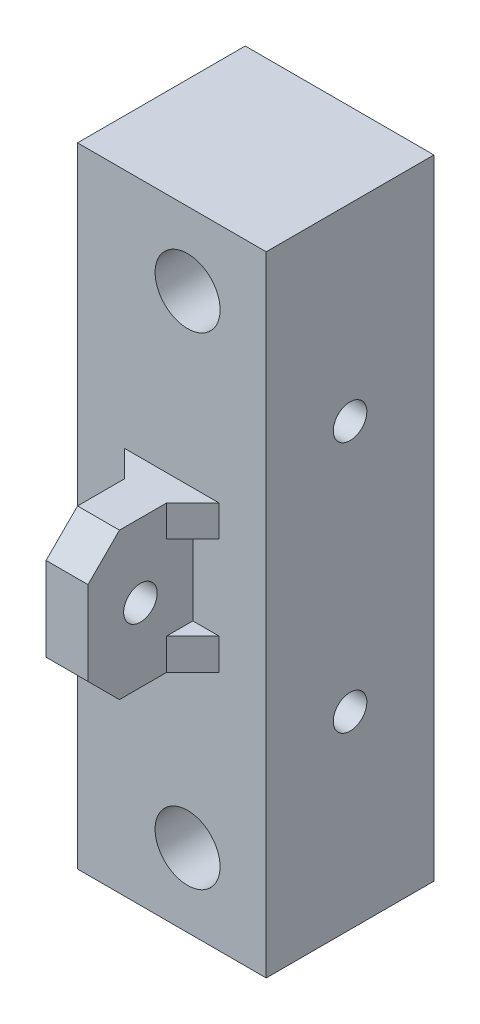
ISO-10303-21;
HEADER;
FILE_DESCRIPTION(('STEP AP214'),'2;1');
FILE_NAME('part.step','',(''),(''),'','','');
FILE_SCHEMA(('AUTOMOTIVE_DESIGN { 1 0 10303 214 1 1 1 1 }'));
ENDSEC;
DATA;
#1=APPLICATION_CONTEXT('core data for automotive mechanical design processes');
#2=APPLICATION_PROTOCOL_DEFINITION('international standard','automotive_design',2000,#1);
#3=PRODUCT_CONTEXT('',#1,'mechanical');
#4=PRODUCT('Part','Part','',(#3));
#5=PRODUCT_RELATED_PRODUCT_CATEGORY('part','',(#4));
#6=PRODUCT_DEFINITION_FORMATION('','',#4);
#7=PRODUCT_DEFINITION_CONTEXT('part definition',#1,'design');
#8=PRODUCT_DEFINITION('design','',#6,#7);
#9=PRODUCT_DEFINITION_SHAPE('','',#8);
#10=(LENGTH_UNIT() NAMED_UNIT(*) SI_UNIT(.MILLI.,.METRE.));
#11=(NAMED_UNIT(*) PLANE_ANGLE_UNIT() SI_UNIT($,.RADIAN.));
#12=(NAMED_UNIT(*) SI_UNIT($,.STERADIAN.) SOLID_ANGLE_UNIT());
#13=UNCERTAINTY_MEASURE_WITH_UNIT(LENGTH_MEASURE(1.E-05),#10,'distance_accuracy_value','');
#14=(GEOMETRIC_REPRESENTATION_CONTEXT(3) GLOBAL_UNCERTAINTY_ASSIGNED_CONTEXT((#13)) GLOBAL_UNIT_ASSIGNED_CONTEXT((#10,
#11,#12)) REPRESENTATION_CONTEXT('',''));
#15=CARTESIAN_POINT('',(0.,0.,0.));
#16=DIRECTION('',(0.,0.,1.));
#17=DIRECTION('',(1.,0.,0.));
#18=AXIS2_PLACEMENT_3D('',#15,#16,#17);
#19=CARTESIAN_POINT('',(0.,0.,16.));
#20=DIRECTION('',(0.,0.,1.));
#21=DIRECTION('',(1.,0.,0.));
#22=AXIS2_PLACEMENT_3D('',#19,#20,#21);
#23=PLANE('',#22);
#24=DIRECTION('',(1.,0.,0.));
#25=VECTOR('',#24,1.);
#26=CARTESIAN_POINT('',(4.5,-4.,16.));
#27=LINE('',#26,#25);
#28=CARTESIAN_POINT('',(2.,-4.,16.));
#29=VERTEX_POINT('',#28);
#30=CARTESIAN_POINT('',(4.5,-4.,16.));
#31=VERTEX_POINT('',#30);
#32=EDGE_CURVE('E51',#29,#31,#27,.T.);
#33=ORIENTED_EDGE('',*,*,#32,.T.);
#34=DIRECTION('',(0.,-1.,0.));
#35=VECTOR('',#34,1.);
#36=CARTESIAN_POINT('',(4.5,-4.,16.));
#37=LINE('',#36,#35);
#38=CARTESIAN_POINT('',(4.5,-7.,16.));
#39=VERTEX_POINT('',#38);
#40=EDGE_CURVE('E305',#31,#39,#37,.T.);
#41=ORIENTED_EDGE('',*,*,#40,.T.);
#42=DIRECTION('',(1.,0.,0.));
#43=VECTOR('',#42,1.);
#44=CARTESIAN_POINT('',(-2.,-7.,16.));
#45=LINE('',#44,#43);
#46=CARTESIAN_POINT('',(-4.5,-7.,16.));
#47=VERTEX_POINT('',#46);
#48=EDGE_CURVE('E59',#47,#39,#45,.T.);
#49=ORIENTED_EDGE('',*,*,#48,.F.);
#50=DIRECTION('',(0.,-1.,0.));
#51=VECTOR('',#50,1.);
#52=CARTESIAN_POINT('',(-4.5,-4.,16.));
#53=LINE('',#52,#51);
#54=CARTESIAN_POINT('',(-4.5,-4.,16.));
#55=VERTEX_POINT('',#54);
#56=EDGE_CURVE('E178',#55,#47,#53,.T.);
#57=ORIENTED_EDGE('',*,*,#56,.F.);
#58=DIRECTION('',(1.,0.,0.));
#59=VECTOR('',#58,1.);
#60=CARTESIAN_POINT('',(-4.5,-4.,16.));
#61=LINE('',#60,#59);
#62=CARTESIAN_POINT('',(-2.,-4.,16.));
#63=VERTEX_POINT('',#62);
#64=EDGE_CURVE('E165',#55,#63,#61,.T.);
#65=ORIENTED_EDGE('',*,*,#64,.T.);
#66=DIRECTION('',(0.,-1.,0.));
#67=VECTOR('',#66,1.);
#68=CARTESIAN_POINT('',(-2.,7.,16.));
#69=LINE('',#68,#67);
#70=CARTESIAN_POINT('',(-2.,4.,16.));
#71=VERTEX_POINT('',#70);
#72=EDGE_CURVE('E175',#71,#63,#69,.T.);
#73=ORIENTED_EDGE('',*,*,#72,.F.);
#74=DIRECTION('',(-1.,0.,0.));
#75=VECTOR('',#74,1.);
#76=CARTESIAN_POINT('',(-2.,4.,16.));
#77=LINE('',#76,#75);
#78=CARTESIAN_POINT('',(-4.50000000000001,4.,16.));
#79=VERTEX_POINT('',#78);
#80=EDGE_CURVE('E313',#71,#79,#77,.T.);
#81=ORIENTED_EDGE('',*,*,#80,.T.);
#82=DIRECTION('',(0.,1.,0.));
#83=VECTOR('',#82,1.);
#84=CARTESIAN_POINT('',(-4.5,4.,16.));
#85=LINE('',#84,#83);
#86=CARTESIAN_POINT('',(-4.5,7.,16.));
#87=VERTEX_POINT('',#86);
#88=EDGE_CURVE('E319',#79,#87,#85,.T.);
#89=ORIENTED_EDGE('',*,*,#88,.T.);
#90=DIRECTION('',(-1.,0.,0.));
#91=VECTOR('',#90,1.);
#92=CARTESIAN_POINT('',(-2.,7.,16.));
#93=LINE('',#92,#91);
#94=CARTESIAN_POINT('',(4.5,7.,16.));
#95=VERTEX_POINT('',#94);
#96=EDGE_CURVE('E184',#95,#87,#93,.T.);
#97=ORIENTED_EDGE('',*,*,#96,.F.);
#98=DIRECTION('',(0.,1.,0.));
#99=VECTOR('',#98,1.);
#100=CARTESIAN_POINT('',(4.5,4.,16.));
#101=LINE('',#100,#99);
#102=CARTESIAN_POINT('',(4.5,4.,16.));
#103=VERTEX_POINT('',#102);
#104=EDGE_CURVE('E339',#103,#95,#101,.T.);
#105=ORIENTED_EDGE('',*,*,#104,.F.);
#106=DIRECTION('',(-1.,0.,0.));
#107=VECTOR('',#106,1.);
#108=CARTESIAN_POINT('',(2.,4.,16.));
#109=LINE('',#108,#107);
#110=CARTESIAN_POINT('',(2.,4.,16.));
#111=VERTEX_POINT('',#110);
#112=EDGE_CURVE('E333',#103,#111,#109,.T.);
#113=ORIENTED_EDGE('',*,*,#112,.T.);
#114=DIRECTION('',(0.,1.,0.));
#115=VECTOR('',#114,1.);
#116=CARTESIAN_POINT('',(2.,7.,16.));
#117=LINE('',#116,#115);
#118=EDGE_CURVE('E188',#29,#111,#117,.T.);
#119=ORIENTED_EDGE('',*,*,#118,.F.);
#120=EDGE_LOOP('',(#33,#41,#49,#57,#65,#73,#81,#89,#97,#105,#113,#119));
#121=FACE_BOUND('',#120,.T.);
#122=CARTESIAN_POINT('',(1.5,23.,16.));
#123=DIRECTION('',(0.,0.,1.));
#124=DIRECTION('',(1.,0.,0.));
#125=AXIS2_PLACEMENT_3D('',#122,#123,#124);
#126=CIRCLE('',#125,3.1);
#127=CARTESIAN_POINT('',(4.6,23.,16.));
#128=VERTEX_POINT('',#127);
#129=EDGE_CURVE('E220',#128,#128,#126,.T.);
#130=ORIENTED_EDGE('',*,*,#129,.F.);
#131=EDGE_LOOP('',(#130));
#132=FACE_BOUND('',#131,.T.);
#133=CARTESIAN_POINT('',(1.5,-23.,16.));
#134=DIRECTION('',(0.,0.,1.));
#135=DIRECTION('',(1.,0.,0.));
#136=AXIS2_PLACEMENT_3D('',#133,#134,#135);
#137=CIRCLE('',#136,3.1);
#138=CARTESIAN_POINT('',(4.6,-23.,16.));
#139=VERTEX_POINT('',#138);
#140=EDGE_CURVE('E207',#139,#139,#137,.T.);
#141=ORIENTED_EDGE('',*,*,#140,.F.);
#142=EDGE_LOOP('',(#141));
#143=FACE_BOUND('',#142,.T.);
#144=DIRECTION('',(0.,1.,0.));
#145=VECTOR('',#144,1.);
#146=CARTESIAN_POINT('',(9.,30.,16.));
#147=LINE('',#146,#145);
#148=CARTESIAN_POINT('',(9.,-30.,16.));
#149=VERTEX_POINT('',#148);
#150=CARTESIAN_POINT('',(9.,30.,16.));
#151=VERTEX_POINT('',#150);
#152=EDGE_CURVE('E228',#149,#151,#147,.T.);
#153=ORIENTED_EDGE('',*,*,#152,.T.);
#154=DIRECTION('',(-1.,0.,0.));
#155=VECTOR('',#154,1.);
#156=CARTESIAN_POINT('',(-9.,30.,16.));
#157=LINE('',#156,#155);
#158=CARTESIAN_POINT('',(-9.,30.,16.));
#159=VERTEX_POINT('',#158);
#160=EDGE_CURVE('E231',#151,#159,#157,.T.);
#161=ORIENTED_EDGE('',*,*,#160,.T.);
#162=DIRECTION('',(0.,-1.,0.));
#163=VECTOR('',#162,1.);
#164=CARTESIAN_POINT('',(-9.,30.,16.));
#165=LINE('',#164,#163);
#166=CARTESIAN_POINT('',(-9.,-30.,16.));
#167=VERTEX_POINT('',#166);
#168=EDGE_CURVE('E234',#159,#167,#165,.T.);
#169=ORIENTED_EDGE('',*,*,#168,.T.);
#170=DIRECTION('',(1.,0.,0.));
#171=VECTOR('',#170,1.);
#172=CARTESIAN_POINT('',(-9.,-30.,16.));
#173=LINE('',#172,#171);
#174=EDGE_CURVE('E236',#167,#149,#173,.T.);
#175=ORIENTED_EDGE('',*,*,#174,.T.);
#176=EDGE_LOOP('',(#153,#161,#169,#175));
#177=FACE_BOUND('',#176,.T.);
#178=ADVANCED_FACE('F35',(#121,#132,#143,#177),#23,.T.);
#179=CARTESIAN_POINT('',(9.,30.,16.));
#180=DIRECTION('',(-1.,0.,0.));
#181=DIRECTION('',(0.,-1.,0.));
#182=AXIS2_PLACEMENT_3D('',#179,#180,#181);
#183=PLANE('',#182);
#184=CARTESIAN_POINT('',(9.,12.,8.));
#185=DIRECTION('',(1.,0.,0.));
#186=DIRECTION('',(0.,1.,0.));
#187=AXIS2_PLACEMENT_3D('',#184,#185,#186);
#188=CIRCLE('',#187,1.6);
#189=CARTESIAN_POINT('',(9.,13.6,8.));
#190=VERTEX_POINT('',#189);
#191=EDGE_CURVE('E208',#190,#190,#188,.T.);
#192=ORIENTED_EDGE('',*,*,#191,.F.);
#193=EDGE_LOOP('',(#192));
#194=FACE_BOUND('',#193,.T.);
#195=CARTESIAN_POINT('',(9.,-12.,8.));
#196=DIRECTION('',(1.,0.,0.));
#197=DIRECTION('',(0.,1.,0.));
#198=AXIS2_PLACEMENT_3D('',#195,#196,#197);
#199=CIRCLE('',#198,1.6);
#200=CARTESIAN_POINT('',(9.,-10.4,8.));
#201=VERTEX_POINT('',#200);
#202=EDGE_CURVE('E203',#201,#201,#199,.T.);
#203=ORIENTED_EDGE('',*,*,#202,.F.);
#204=EDGE_LOOP('',(#203));
#205=FACE_BOUND('',#204,.T.);
#206=DIRECTION('',(0.,1.,0.));
#207=VECTOR('',#206,1.);
#208=CARTESIAN_POINT('',(9.,30.,0.));
#209=LINE('',#208,#207);
#210=CARTESIAN_POINT('',(9.,-30.,0.));
#211=VERTEX_POINT('',#210);
#212=CARTESIAN_POINT('',(9.,30.,0.));
#213=VERTEX_POINT('',#212);
#214=EDGE_CURVE('E219',#211,#213,#209,.T.);
#215=ORIENTED_EDGE('',*,*,#214,.T.);
#216=DIRECTION('',(0.,0.,-1.));
#217=VECTOR('',#216,1.);
#218=CARTESIAN_POINT('',(9.,30.,16.));
#219=LINE('',#218,#217);
#220=EDGE_CURVE('E254',#151,#213,#219,.T.);
#221=ORIENTED_EDGE('',*,*,#220,.F.);
#222=ORIENTED_EDGE('',*,*,#152,.F.);
#223=DIRECTION('',(0.,0.,-1.));
#224=VECTOR('',#223,1.);
#225=CARTESIAN_POINT('',(9.,-30.,16.));
#226=LINE('',#225,#224);
#227=EDGE_CURVE('E238',#149,#211,#226,.T.);
#228=ORIENTED_EDGE('',*,*,#227,.T.);
#229=EDGE_LOOP('',(#215,#221,#222,#228));
#230=FACE_BOUND('',#229,.T.);
#231=ADVANCED_FACE('F380',(#194,#205,#230),#183,.F.);
#232=CARTESIAN_POINT('',(-9.,30.,16.));
#233=DIRECTION('',(0.,-1.,0.));
#234=DIRECTION('',(0.,0.,-1.));
#235=AXIS2_PLACEMENT_3D('',#232,#233,#234);
#236=PLANE('',#235);
#237=DIRECTION('',(-1.,0.,0.));
#238=VECTOR('',#237,1.);
#239=CARTESIAN_POINT('',(-9.,30.,0.));
#240=LINE('',#239,#238);
#241=CARTESIAN_POINT('',(-9.,30.,0.));
#242=VERTEX_POINT('',#241);
#243=EDGE_CURVE('E241',#213,#242,#240,.T.);
#244=ORIENTED_EDGE('',*,*,#243,.T.);
#245=DIRECTION('',(0.,0.,-1.));
#246=VECTOR('',#245,1.);
#247=CARTESIAN_POINT('',(-9.,30.,16.));
#248=LINE('',#247,#246);
#249=EDGE_CURVE('E251',#159,#242,#248,.T.);
#250=ORIENTED_EDGE('',*,*,#249,.F.);
#251=ORIENTED_EDGE('',*,*,#160,.F.);
#252=ORIENTED_EDGE('',*,*,#220,.T.);
#253=EDGE_LOOP('',(#244,#250,#251,#252));
#254=FACE_BOUND('',#253,.T.);
#255=ADVANCED_FACE('F385',(#254),#236,.F.);
#256=CARTESIAN_POINT('',(-9.,30.,16.));
#257=DIRECTION('',(1.,0.,0.));
#258=DIRECTION('',(0.,1.,0.));
#259=AXIS2_PLACEMENT_3D('',#256,#257,#258);
#260=PLANE('',#259);
#261=CARTESIAN_POINT('',(-9.00000000000001,12.,8.));
#262=DIRECTION('',(1.,0.,0.));
#263=DIRECTION('',(0.,1.,0.));
#264=AXIS2_PLACEMENT_3D('',#261,#262,#263);
#265=CIRCLE('',#264,1.6);
#266=CARTESIAN_POINT('',(-9.00000000000001,13.6,8.));
#267=VERTEX_POINT('',#266);
#268=EDGE_CURVE('E204',#267,#267,#265,.T.);
#269=ORIENTED_EDGE('',*,*,#268,.T.);
#270=EDGE_LOOP('',(#269));
#271=FACE_BOUND('',#270,.T.);
#272=CARTESIAN_POINT('',(-9.00000000000001,-12.,8.));
#273=DIRECTION('',(1.,0.,0.));
#274=DIRECTION('',(0.,1.,0.));
#275=AXIS2_PLACEMENT_3D('',#272,#273,#274);
#276=CIRCLE('',#275,1.6);
#277=CARTESIAN_POINT('',(-9.00000000000001,-10.4,8.));
#278=VERTEX_POINT('',#277);
#279=EDGE_CURVE('E211',#278,#278,#276,.T.);
#280=ORIENTED_EDGE('',*,*,#279,.T.);
#281=EDGE_LOOP('',(#280));
#282=FACE_BOUND('',#281,.T.);
#283=DIRECTION('',(0.,-1.,0.));
#284=VECTOR('',#283,1.);
#285=CARTESIAN_POINT('',(-9.,30.,0.));
#286=LINE('',#285,#284);
#287=CARTESIAN_POINT('',(-9.,-30.,0.));
#288=VERTEX_POINT('',#287);
#289=EDGE_CURVE('E243',#242,#288,#286,.T.);
#290=ORIENTED_EDGE('',*,*,#289,.T.);
#291=DIRECTION('',(0.,0.,-1.));
#292=VECTOR('',#291,1.);
#293=CARTESIAN_POINT('',(-9.,-30.,16.));
#294=LINE('',#293,#292);
#295=EDGE_CURVE('E248',#167,#288,#294,.T.);
#296=ORIENTED_EDGE('',*,*,#295,.F.);
#297=ORIENTED_EDGE('',*,*,#168,.F.);
#298=ORIENTED_EDGE('',*,*,#249,.T.);
#299=EDGE_LOOP('',(#290,#296,#297,#298));
#300=FACE_BOUND('',#299,.T.);
#301=ADVANCED_FACE('F399',(#271,#282,#300),#260,.F.);
#302=CARTESIAN_POINT('',(-9.,-30.,16.));
#303=DIRECTION('',(0.,1.,0.));
#304=DIRECTION('',(0.,0.,1.));
#305=AXIS2_PLACEMENT_3D('',#302,#303,#304);
#306=PLANE('',#305);
#307=DIRECTION('',(1.,0.,0.));
#308=VECTOR('',#307,1.);
#309=CARTESIAN_POINT('',(-9.,-30.,0.));
#310=LINE('',#309,#308);
#311=EDGE_CURVE('E232',#288,#211,#310,.T.);
#312=ORIENTED_EDGE('',*,*,#311,.T.);
#313=ORIENTED_EDGE('',*,*,#227,.F.);
#314=ORIENTED_EDGE('',*,*,#174,.F.);
#315=ORIENTED_EDGE('',*,*,#295,.T.);
#316=EDGE_LOOP('',(#312,#313,#314,#315));
#317=FACE_BOUND('',#316,.T.);
#318=ADVANCED_FACE('F395',(#317),#306,.F.);
#319=CARTESIAN_POINT('',(0.,0.,0.));
#320=DIRECTION('',(0.,0.,1.));
#321=DIRECTION('',(1.,0.,0.));
#322=AXIS2_PLACEMENT_3D('',#319,#320,#321);
#323=PLANE('',#322);
#324=CARTESIAN_POINT('',(1.5,23.,0.));
#325=DIRECTION('',(0.,0.,1.));
#326=DIRECTION('',(1.,0.,0.));
#327=AXIS2_PLACEMENT_3D('',#324,#325,#326);
#328=CIRCLE('',#327,3.1);
#329=CARTESIAN_POINT('',(4.6,23.,0.));
#330=VERTEX_POINT('',#329);
#331=EDGE_CURVE('E216',#330,#330,#328,.T.);
#332=ORIENTED_EDGE('',*,*,#331,.T.);
#333=EDGE_LOOP('',(#332));
#334=FACE_BOUND('',#333,.T.);
#335=CARTESIAN_POINT('',(1.5,-23.,0.));
#336=DIRECTION('',(0.,0.,1.));
#337=DIRECTION('',(1.,0.,0.));
#338=AXIS2_PLACEMENT_3D('',#335,#336,#337);
#339=CIRCLE('',#338,3.1);
#340=CARTESIAN_POINT('',(4.6,-23.,0.));
#341=VERTEX_POINT('',#340);
#342=EDGE_CURVE('E223',#341,#341,#339,.T.);
#343=ORIENTED_EDGE('',*,*,#342,.T.);
#344=EDGE_LOOP('',(#343));
#345=FACE_BOUND('',#344,.T.);
#346=ORIENTED_EDGE('',*,*,#214,.F.);
#347=ORIENTED_EDGE('',*,*,#311,.F.);
#348=ORIENTED_EDGE('',*,*,#289,.F.);
#349=ORIENTED_EDGE('',*,*,#243,.F.);
#350=EDGE_LOOP('',(#346,#347,#348,#349));
#351=FACE_BOUND('',#350,.T.);
#352=ADVANCED_FACE('F392',(#334,#345,#351),#323,.F.);
#353=CARTESIAN_POINT('',(1.5,-23.,0.));
#354=DIRECTION('',(0.,0.,1.));
#355=DIRECTION('',(1.,0.,0.));
#356=AXIS2_PLACEMENT_3D('',#353,#354,#355);
#357=CYLINDRICAL_SURFACE('',#356,3.1);
#358=ORIENTED_EDGE('',*,*,#342,.F.);
#359=EDGE_LOOP('',(#358));
#360=FACE_BOUND('',#359,.T.);
#361=ORIENTED_EDGE('',*,*,#140,.T.);
#362=EDGE_LOOP('',(#361));
#363=FACE_BOUND('',#362,.T.);
#364=ADVANCED_FACE('F390',(#360,#363),#357,.F.);
#365=CARTESIAN_POINT('',(1.5,23.,0.));
#366=DIRECTION('',(0.,0.,1.));
#367=DIRECTION('',(1.,0.,0.));
#368=AXIS2_PLACEMENT_3D('',#365,#366,#367);
#369=CYLINDRICAL_SURFACE('',#368,3.1);
#370=ORIENTED_EDGE('',*,*,#331,.F.);
#371=EDGE_LOOP('',(#370));
#372=FACE_BOUND('',#371,.T.);
#373=ORIENTED_EDGE('',*,*,#129,.T.);
#374=EDGE_LOOP('',(#373));
#375=FACE_BOUND('',#374,.T.);
#376=ADVANCED_FACE('F441',(#372,#375),#369,.F.);
#377=CARTESIAN_POINT('',(-9.00000000000001,-12.,8.));
#378=DIRECTION('',(1.,0.,0.));
#379=DIRECTION('',(0.,1.,0.));
#380=AXIS2_PLACEMENT_3D('',#377,#378,#379);
#381=CYLINDRICAL_SURFACE('',#380,1.6);
#382=ORIENTED_EDGE('',*,*,#279,.F.);
#383=EDGE_LOOP('',(#382));
#384=FACE_BOUND('',#383,.T.);
#385=ORIENTED_EDGE('',*,*,#202,.T.);
#386=EDGE_LOOP('',(#385));
#387=FACE_BOUND('',#386,.T.);
#388=ADVANCED_FACE('F438',(#384,#387),#381,.F.);
#389=CARTESIAN_POINT('',(-9.00000000000001,12.,8.));
#390=DIRECTION('',(1.,0.,0.));
#391=DIRECTION('',(0.,1.,0.));
#392=AXIS2_PLACEMENT_3D('',#389,#390,#391);
#393=CYLINDRICAL_SURFACE('',#392,1.6);
#394=ORIENTED_EDGE('',*,*,#268,.F.);
#395=EDGE_LOOP('',(#394));
#396=FACE_BOUND('',#395,.T.);
#397=ORIENTED_EDGE('',*,*,#191,.T.);
#398=EDGE_LOOP('',(#397));
#399=FACE_BOUND('',#398,.T.);
#400=ADVANCED_FACE('F434',(#396,#399),#393,.F.);
#401=CARTESIAN_POINT('',(2.,7.,26.));
#402=DIRECTION('',(-1.,0.,0.));
#403=DIRECTION('',(0.,-1.,0.));
#404=AXIS2_PLACEMENT_3D('',#401,#402,#403);
#405=PLANE('',#404);
#406=CARTESIAN_POINT('',(2.,0.,21.));
#407=DIRECTION('',(1.,0.,0.));
#408=DIRECTION('',(0.,1.,0.));
#409=AXIS2_PLACEMENT_3D('',#406,#407,#408);
#410=CIRCLE('',#409,1.6);
#411=CARTESIAN_POINT('',(2.,1.6,21.));
#412=VERTEX_POINT('',#411);
#413=EDGE_CURVE('E261',#412,#412,#410,.T.);
#414=ORIENTED_EDGE('',*,*,#413,.F.);
#415=EDGE_LOOP('',(#414));
#416=FACE_BOUND('',#415,.T.);
#417=DIRECTION('',(0.,0.,-1.));
#418=VECTOR('',#417,1.);
#419=CARTESIAN_POINT('',(2.,-7.,26.));
#420=LINE('',#419,#418);
#421=CARTESIAN_POINT('',(2.,-7.,23.));
#422=VERTEX_POINT('',#421);
#423=CARTESIAN_POINT('',(2.,-7.,18.5));
#424=VERTEX_POINT('',#423);
#425=EDGE_CURVE('E192',#422,#424,#420,.T.);
#426=ORIENTED_EDGE('',*,*,#425,.T.);
#427=DIRECTION('',(0.,-1.,0.));
#428=VECTOR('',#427,1.);
#429=CARTESIAN_POINT('',(2.,-4.,18.5));
#430=LINE('',#429,#428);
#431=CARTESIAN_POINT('',(2.,-4.,18.5));
#432=VERTEX_POINT('',#431);
#433=EDGE_CURVE('E303',#432,#424,#430,.T.);
#434=ORIENTED_EDGE('',*,*,#433,.F.);
#435=DIRECTION('',(0.,0.,-1.));
#436=VECTOR('',#435,1.);
#437=CARTESIAN_POINT('',(2.,-4.,16.));
#438=LINE('',#437,#436);
#439=EDGE_CURVE('E301',#432,#29,#438,.T.);
#440=ORIENTED_EDGE('',*,*,#439,.T.);
#441=ORIENTED_EDGE('',*,*,#118,.T.);
#442=DIRECTION('',(0.,0.,1.));
#443=VECTOR('',#442,1.);
#444=CARTESIAN_POINT('',(2.,4.,18.5));
#445=LINE('',#444,#443);
#446=CARTESIAN_POINT('',(2.,4.,18.5));
#447=VERTEX_POINT('',#446);
#448=EDGE_CURVE('E328',#111,#447,#445,.T.);
#449=ORIENTED_EDGE('',*,*,#448,.T.);
#450=DIRECTION('',(0.,1.,0.));
#451=VECTOR('',#450,1.);
#452=CARTESIAN_POINT('',(2.,4.,18.5));
#453=LINE('',#452,#451);
#454=CARTESIAN_POINT('',(2.,7.,18.5));
#455=VERTEX_POINT('',#454);
#456=EDGE_CURVE('E336',#447,#455,#453,.T.);
#457=ORIENTED_EDGE('',*,*,#456,.T.);
#458=DIRECTION('',(0.,0.,-1.));
#459=VECTOR('',#458,1.);
#460=CARTESIAN_POINT('',(2.,7.,26.));
#461=LINE('',#460,#459);
#462=CARTESIAN_POINT('',(2.,7.,23.));
#463=VERTEX_POINT('',#462);
#464=EDGE_CURVE('E200',#463,#455,#461,.T.);
#465=ORIENTED_EDGE('',*,*,#464,.F.);
#466=DIRECTION('',(0.,-0.707106781186546,0.707106781186549));
#467=VECTOR('',#466,1.);
#468=CARTESIAN_POINT('',(2.,4.,26.));
#469=LINE('',#468,#467);
#470=CARTESIAN_POINT('',(2.,4.,26.));
#471=VERTEX_POINT('',#470);
#472=EDGE_CURVE('E267',#463,#471,#469,.T.);
#473=ORIENTED_EDGE('',*,*,#472,.T.);
#474=DIRECTION('',(0.,1.,0.));
#475=VECTOR('',#474,1.);
#476=CARTESIAN_POINT('',(2.,7.,26.));
#477=LINE('',#476,#475);
#478=CARTESIAN_POINT('',(2.,-4.,26.));
#479=VERTEX_POINT('',#478);
#480=EDGE_CURVE('E186',#479,#471,#477,.T.);
#481=ORIENTED_EDGE('',*,*,#480,.F.);
#482=DIRECTION('',(0.,-0.707106781186546,-0.707106781186549));
#483=VECTOR('',#482,1.);
#484=CARTESIAN_POINT('',(2.,-4.,26.));
#485=LINE('',#484,#483);
#486=EDGE_CURVE('E269',#479,#422,#485,.T.);
#487=ORIENTED_EDGE('',*,*,#486,.T.);
#488=EDGE_LOOP('',(#426,#434,#440,#441,#449,#457,#465,#473,#481,#487));
#489=FACE_BOUND('',#488,.T.);
#490=ADVANCED_FACE('F290',(#416,#489),#405,.F.);
#491=CARTESIAN_POINT('',(-2.,7.,26.));
#492=DIRECTION('',(0.,-1.,0.));
#493=DIRECTION('',(0.,0.,-1.));
#494=AXIS2_PLACEMENT_3D('',#491,#492,#493);
#495=PLANE('',#494);
#496=DIRECTION('',(0.,0.,-1.));
#497=VECTOR('',#496,1.);
#498=CARTESIAN_POINT('',(-2.,7.,26.));
#499=LINE('',#498,#497);
#500=CARTESIAN_POINT('',(-2.,7.,23.));
#501=VERTEX_POINT('',#500);
#502=CARTESIAN_POINT('',(-2.,7.,18.5));
#503=VERTEX_POINT('',#502);
#504=EDGE_CURVE('E198',#501,#503,#499,.T.);
#505=ORIENTED_EDGE('',*,*,#504,.F.);
#506=DIRECTION('',(1.,0.,0.));
#507=VECTOR('',#506,1.);
#508=CARTESIAN_POINT('',(2.,7.,23.));
#509=LINE('',#508,#507);
#510=EDGE_CURVE('E11',#501,#463,#509,.T.);
#511=ORIENTED_EDGE('',*,*,#510,.T.);
#512=ORIENTED_EDGE('',*,*,#464,.T.);
#513=DIRECTION('',(0.707106781186548,0.,-0.707106781186547));
#514=VECTOR('',#513,1.);
#515=CARTESIAN_POINT('',(4.5,7.,16.));
#516=LINE('',#515,#514);
#517=EDGE_CURVE('E325',#455,#95,#516,.T.);
#518=ORIENTED_EDGE('',*,*,#517,.T.);
#519=ORIENTED_EDGE('',*,*,#96,.T.);
#520=DIRECTION('',(0.707106781186548,0.,0.707106781186547));
#521=VECTOR('',#520,1.);
#522=CARTESIAN_POINT('',(-4.5,7.,16.));
#523=LINE('',#522,#521);
#524=EDGE_CURVE('E311',#87,#503,#523,.T.);
#525=ORIENTED_EDGE('',*,*,#524,.T.);
#526=EDGE_LOOP('',(#505,#511,#512,#518,#519,#525));
#527=FACE_BOUND('',#526,.T.);
#528=ADVANCED_FACE('F357',(#527),#495,.F.);
#529=CARTESIAN_POINT('',(-2.,7.,26.));
#530=DIRECTION('',(1.,0.,0.));
#531=DIRECTION('',(0.,1.,0.));
#532=AXIS2_PLACEMENT_3D('',#529,#530,#531);
#533=PLANE('',#532);
#534=CARTESIAN_POINT('',(-2.,0.,21.));
#535=DIRECTION('',(1.,0.,0.));
#536=DIRECTION('',(0.,1.,0.));
#537=AXIS2_PLACEMENT_3D('',#534,#535,#536);
#538=CIRCLE('',#537,1.6);
#539=CARTESIAN_POINT('',(-2.,1.6,21.));
#540=VERTEX_POINT('',#539);
#541=EDGE_CURVE('E258',#540,#540,#538,.T.);
#542=ORIENTED_EDGE('',*,*,#541,.T.);
#543=EDGE_LOOP('',(#542));
#544=FACE_BOUND('',#543,.T.);
#545=DIRECTION('',(0.,0.,1.));
#546=VECTOR('',#545,1.);
#547=CARTESIAN_POINT('',(-2.,-4.,16.));
#548=LINE('',#547,#546);
#549=CARTESIAN_POINT('',(-2.,-4.,18.5));
#550=VERTEX_POINT('',#549);
#551=EDGE_CURVE('E162',#63,#550,#548,.T.);
#552=ORIENTED_EDGE('',*,*,#551,.T.);
#553=DIRECTION('',(0.,-1.,0.));
#554=VECTOR('',#553,1.);
#555=CARTESIAN_POINT('',(-2.,-4.,18.5));
#556=LINE('',#555,#554);
#557=CARTESIAN_POINT('',(-2.,-7.,18.5));
#558=VERTEX_POINT('',#557);
#559=EDGE_CURVE('E308',#550,#558,#556,.T.);
#560=ORIENTED_EDGE('',*,*,#559,.T.);
#561=DIRECTION('',(0.,0.,-1.));
#562=VECTOR('',#561,1.);
#563=CARTESIAN_POINT('',(-2.,-7.,26.));
#564=LINE('',#563,#562);
#565=CARTESIAN_POINT('',(-2.,-7.,23.));
#566=VERTEX_POINT('',#565);
#567=EDGE_CURVE('E194',#566,#558,#564,.T.);
#568=ORIENTED_EDGE('',*,*,#567,.F.);
#569=DIRECTION('',(0.,0.707106781186546,0.707106781186549));
#570=VECTOR('',#569,1.);
#571=CARTESIAN_POINT('',(-2.,-4.,26.));
#572=LINE('',#571,#570);
#573=CARTESIAN_POINT('',(-2.,-4.,26.));
#574=VERTEX_POINT('',#573);
#575=EDGE_CURVE('E44',#566,#574,#572,.T.);
#576=ORIENTED_EDGE('',*,*,#575,.T.);
#577=DIRECTION('',(0.,-1.,0.));
#578=VECTOR('',#577,1.);
#579=CARTESIAN_POINT('',(-2.,7.,26.));
#580=LINE('',#579,#578);
#581=CARTESIAN_POINT('',(-2.,4.,26.));
#582=VERTEX_POINT('',#581);
#583=EDGE_CURVE('E195',#582,#574,#580,.T.);
#584=ORIENTED_EDGE('',*,*,#583,.F.);
#585=DIRECTION('',(0.,0.707106781186546,-0.707106781186549));
#586=VECTOR('',#585,1.);
#587=CARTESIAN_POINT('',(-2.,4.,26.));
#588=LINE('',#587,#586);
#589=EDGE_CURVE('E273',#582,#501,#588,.T.);
#590=ORIENTED_EDGE('',*,*,#589,.T.);
#591=ORIENTED_EDGE('',*,*,#504,.T.);
#592=DIRECTION('',(0.,1.,0.));
#593=VECTOR('',#592,1.);
#594=CARTESIAN_POINT('',(-2.,4.,18.5));
#595=LINE('',#594,#593);
#596=CARTESIAN_POINT('',(-2.,4.,18.5));
#597=VERTEX_POINT('',#596);
#598=EDGE_CURVE('E322',#597,#503,#595,.T.);
#599=ORIENTED_EDGE('',*,*,#598,.F.);
#600=DIRECTION('',(0.,0.,-1.));
#601=VECTOR('',#600,1.);
#602=CARTESIAN_POINT('',(-2.,4.,18.5));
#603=LINE('',#602,#601);
#604=EDGE_CURVE('E183',#597,#71,#603,.T.);
#605=ORIENTED_EDGE('',*,*,#604,.T.);
#606=ORIENTED_EDGE('',*,*,#72,.T.);
#607=EDGE_LOOP('',(#552,#560,#568,#576,#584,#590,#591,#599,#605,#606));
#608=FACE_BOUND('',#607,.T.);
#609=ADVANCED_FACE('F181',(#544,#608),#533,.F.);
#610=CARTESIAN_POINT('',(-2.,-7.,26.));
#611=DIRECTION('',(0.,1.,0.));
#612=DIRECTION('',(0.,0.,1.));
#613=AXIS2_PLACEMENT_3D('',#610,#611,#612);
#614=PLANE('',#613);
#615=ORIENTED_EDGE('',*,*,#425,.F.);
#616=DIRECTION('',(-1.,0.,0.));
#617=VECTOR('',#616,1.);
#618=CARTESIAN_POINT('',(-2.,-7.,23.));
#619=LINE('',#618,#617);
#620=EDGE_CURVE('E271',#422,#566,#619,.T.);
#621=ORIENTED_EDGE('',*,*,#620,.T.);
#622=ORIENTED_EDGE('',*,*,#567,.T.);
#623=DIRECTION('',(-0.707106781186548,0.,-0.707106781186547));
#624=VECTOR('',#623,1.);
#625=CARTESIAN_POINT('',(-2.,-7.,18.5));
#626=LINE('',#625,#624);
#627=EDGE_CURVE('E179',#558,#47,#626,.T.);
#628=ORIENTED_EDGE('',*,*,#627,.T.);
#629=ORIENTED_EDGE('',*,*,#48,.T.);
#630=DIRECTION('',(-0.707106781186548,0.,0.707106781186547));
#631=VECTOR('',#630,1.);
#632=CARTESIAN_POINT('',(2.,-7.,18.5));
#633=LINE('',#632,#631);
#634=EDGE_CURVE('E294',#39,#424,#633,.T.);
#635=ORIENTED_EDGE('',*,*,#634,.T.);
#636=EDGE_LOOP('',(#615,#621,#622,#628,#629,#635));
#637=FACE_BOUND('',#636,.T.);
#638=ADVANCED_FACE('F292',(#637),#614,.F.);
#639=CARTESIAN_POINT('',(0.,0.,26.));
#640=DIRECTION('',(0.,0.,1.));
#641=DIRECTION('',(1.,0.,0.));
#642=AXIS2_PLACEMENT_3D('',#639,#640,#641);
#643=PLANE('',#642);
#644=ORIENTED_EDGE('',*,*,#583,.T.);
#645=DIRECTION('',(1.,0.,0.));
#646=VECTOR('',#645,1.);
#647=CARTESIAN_POINT('',(2.,-4.,26.));
#648=LINE('',#647,#646);
#649=EDGE_CURVE('E264',#574,#479,#648,.T.);
#650=ORIENTED_EDGE('',*,*,#649,.T.);
#651=ORIENTED_EDGE('',*,*,#480,.T.);
#652=DIRECTION('',(-1.,0.,0.));
#653=VECTOR('',#652,1.);
#654=CARTESIAN_POINT('',(-2.,4.,26.));
#655=LINE('',#654,#653);
#656=EDGE_CURVE('E257',#471,#582,#655,.T.);
#657=ORIENTED_EDGE('',*,*,#656,.T.);
#658=EDGE_LOOP('',(#644,#650,#651,#657));
#659=FACE_BOUND('',#658,.T.);
#660=ADVANCED_FACE('F282',(#659),#643,.T.);
#661=CARTESIAN_POINT('',(-8.,0.,21.));
#662=DIRECTION('',(1.,0.,0.));
#663=DIRECTION('',(0.,1.,0.));
#664=AXIS2_PLACEMENT_3D('',#661,#662,#663);
#665=CYLINDRICAL_SURFACE('',#664,1.6);
#666=ORIENTED_EDGE('',*,*,#413,.T.);
#667=EDGE_LOOP('',(#666));
#668=FACE_BOUND('',#667,.T.);
#669=ORIENTED_EDGE('',*,*,#541,.F.);
#670=EDGE_LOOP('',(#669));
#671=FACE_BOUND('',#670,.T.);
#672=ADVANCED_FACE('F410',(#668,#671),#665,.F.);
#673=CARTESIAN_POINT('',(0.,-4.,26.));
#674=DIRECTION('',(0.,-0.707106781186549,0.707106781186546));
#675=DIRECTION('',(-1.,0.,0.));
#676=AXIS2_PLACEMENT_3D('',#673,#674,#675);
#677=PLANE('',#676);
#678=ORIENTED_EDGE('',*,*,#575,.F.);
#679=ORIENTED_EDGE('',*,*,#620,.F.);
#680=ORIENTED_EDGE('',*,*,#486,.F.);
#681=ORIENTED_EDGE('',*,*,#649,.F.);
#682=EDGE_LOOP('',(#678,#679,#680,#681));
#683=FACE_BOUND('',#682,.T.);
#684=ADVANCED_FACE('F287',(#683),#677,.T.);
#685=CARTESIAN_POINT('',(0.,4.,26.));
#686=DIRECTION('',(0.,0.707106781186549,0.707106781186546));
#687=DIRECTION('',(1.,0.,0.));
#688=AXIS2_PLACEMENT_3D('',#685,#686,#687);
#689=PLANE('',#688);
#690=ORIENTED_EDGE('',*,*,#472,.F.);
#691=ORIENTED_EDGE('',*,*,#510,.F.);
#692=ORIENTED_EDGE('',*,*,#589,.F.);
#693=ORIENTED_EDGE('',*,*,#656,.F.);
#694=EDGE_LOOP('',(#690,#691,#692,#693));
#695=FACE_BOUND('',#694,.T.);
#696=ADVANCED_FACE('F38',(#695),#689,.T.);
#697=CARTESIAN_POINT('',(4.5,4.,16.));
#698=DIRECTION('',(0.707106781186547,0.,0.707106781186548));
#699=DIRECTION('',(0.707106781186548,0.,-0.707106781186547));
#700=AXIS2_PLACEMENT_3D('',#697,#698,#699);
#701=PLANE('',#700);
#702=ORIENTED_EDGE('',*,*,#517,.F.);
#703=ORIENTED_EDGE('',*,*,#456,.F.);
#704=DIRECTION('',(0.707106781186548,0.,-0.707106781186547));
#705=VECTOR('',#704,1.);
#706=CARTESIAN_POINT('',(4.5,4.,16.));
#707=LINE('',#706,#705);
#708=EDGE_CURVE('E331',#447,#103,#707,.T.);
#709=ORIENTED_EDGE('',*,*,#708,.T.);
#710=ORIENTED_EDGE('',*,*,#104,.T.);
#711=EDGE_LOOP('',(#702,#703,#709,#710));
#712=FACE_BOUND('',#711,.T.);
#713=ADVANCED_FACE('F354',(#712),#701,.T.);
#714=CARTESIAN_POINT('',(0.,4.,0.));
#715=DIRECTION('',(0.,-1.,0.));
#716=DIRECTION('',(0.,0.,-1.));
#717=AXIS2_PLACEMENT_3D('',#714,#715,#716);
#718=PLANE('',#717);
#719=ORIENTED_EDGE('',*,*,#448,.F.);
#720=ORIENTED_EDGE('',*,*,#112,.F.);
#721=ORIENTED_EDGE('',*,*,#708,.F.);
#722=EDGE_LOOP('',(#719,#720,#721));
#723=FACE_BOUND('',#722,.T.);
#724=ADVANCED_FACE('F351',(#723),#718,.T.);
#725=CARTESIAN_POINT('',(-4.5,4.,16.));
#726=DIRECTION('',(-0.707106781186547,0.,0.707106781186548));
#727=DIRECTION('',(0.707106781186548,0.,0.707106781186547));
#728=AXIS2_PLACEMENT_3D('',#725,#726,#727);
#729=PLANE('',#728);
#730=ORIENTED_EDGE('',*,*,#524,.F.);
#731=ORIENTED_EDGE('',*,*,#88,.F.);
#732=DIRECTION('',(0.707106781186548,0.,0.707106781186547));
#733=VECTOR('',#732,1.);
#734=CARTESIAN_POINT('',(-4.5,4.,16.));
#735=LINE('',#734,#733);
#736=EDGE_CURVE('E315',#79,#597,#735,.T.);
#737=ORIENTED_EDGE('',*,*,#736,.T.);
#738=ORIENTED_EDGE('',*,*,#598,.T.);
#739=EDGE_LOOP('',(#730,#731,#737,#738));
#740=FACE_BOUND('',#739,.T.);
#741=ADVANCED_FACE('F365',(#740),#729,.T.);
#742=CARTESIAN_POINT('',(0.,4.,0.));
#743=DIRECTION('',(0.,-1.,0.));
#744=DIRECTION('',(0.,0.,-1.));
#745=AXIS2_PLACEMENT_3D('',#742,#743,#744);
#746=PLANE('',#745);
#747=ORIENTED_EDGE('',*,*,#80,.F.);
#748=ORIENTED_EDGE('',*,*,#604,.F.);
#749=ORIENTED_EDGE('',*,*,#736,.F.);
#750=EDGE_LOOP('',(#747,#748,#749));
#751=FACE_BOUND('',#750,.T.);
#752=ADVANCED_FACE('F368',(#751),#746,.T.);
#753=CARTESIAN_POINT('',(-2.,-4.,18.5));
#754=DIRECTION('',(-0.707106781186547,0.,0.707106781186548));
#755=DIRECTION('',(0.707106781186548,0.,0.707106781186547));
#756=AXIS2_PLACEMENT_3D('',#753,#754,#755);
#757=PLANE('',#756);
#758=ORIENTED_EDGE('',*,*,#627,.F.);
#759=ORIENTED_EDGE('',*,*,#559,.F.);
#760=DIRECTION('',(-0.707106781186548,0.,-0.707106781186547));
#761=VECTOR('',#760,1.);
#762=CARTESIAN_POINT('',(-2.,-4.,18.5));
#763=LINE('',#762,#761);
#764=EDGE_CURVE('E167',#550,#55,#763,.T.);
#765=ORIENTED_EDGE('',*,*,#764,.T.);
#766=ORIENTED_EDGE('',*,*,#56,.T.);
#767=EDGE_LOOP('',(#758,#759,#765,#766));
#768=FACE_BOUND('',#767,.T.);
#769=ADVANCED_FACE('F370',(#768),#757,.T.);
#770=CARTESIAN_POINT('',(0.,-4.,0.));
#771=DIRECTION('',(0.,-1.,0.));
#772=DIRECTION('',(0.,0.,-1.));
#773=AXIS2_PLACEMENT_3D('',#770,#771,#772);
#774=PLANE('',#773);
#775=ORIENTED_EDGE('',*,*,#64,.F.);
#776=ORIENTED_EDGE('',*,*,#764,.F.);
#777=ORIENTED_EDGE('',*,*,#551,.F.);
#778=EDGE_LOOP('',(#775,#776,#777));
#779=FACE_BOUND('',#778,.T.);
#780=ADVANCED_FACE('F164',(#779),#774,.F.);
#781=CARTESIAN_POINT('',(2.,-4.,18.5));
#782=DIRECTION('',(0.707106781186547,0.,0.707106781186548));
#783=DIRECTION('',(0.707106781186548,0.,-0.707106781186547));
#784=AXIS2_PLACEMENT_3D('',#781,#782,#783);
#785=PLANE('',#784);
#786=ORIENTED_EDGE('',*,*,#634,.F.);
#787=ORIENTED_EDGE('',*,*,#40,.F.);
#788=DIRECTION('',(-0.707106781186548,0.,0.707106781186547));
#789=VECTOR('',#788,1.);
#790=CARTESIAN_POINT('',(2.,-4.,18.5));
#791=LINE('',#790,#789);
#792=EDGE_CURVE('E297',#31,#432,#791,.T.);
#793=ORIENTED_EDGE('',*,*,#792,.T.);
#794=ORIENTED_EDGE('',*,*,#433,.T.);
#795=EDGE_LOOP('',(#786,#787,#793,#794));
#796=FACE_BOUND('',#795,.T.);
#797=ADVANCED_FACE('F608',(#796),#785,.T.);
#798=CARTESIAN_POINT('',(0.,-4.,0.));
#799=DIRECTION('',(0.,1.,0.));
#800=DIRECTION('',(0.,0.,1.));
#801=AXIS2_PLACEMENT_3D('',#798,#799,#800);
#802=PLANE('',#801);
#803=ORIENTED_EDGE('',*,*,#32,.F.);
#804=ORIENTED_EDGE('',*,*,#439,.F.);
#805=ORIENTED_EDGE('',*,*,#792,.F.);
#806=EDGE_LOOP('',(#803,#804,#805));
#807=FACE_BOUND('',#806,.T.);
#808=ADVANCED_FACE('F617',(#807),#802,.T.);
#809=CLOSED_SHELL('',(#178,#231,#255,#301,#318,#352,#364,#376,#388,#400,#490,#528,#609,#638,
#660,#672,#684,#696,#713,#724,#741,#752,#769,#780,#797,#808));
#810=MANIFOLD_SOLID_BREP('B2',#809);
#811=ADVANCED_BREP_SHAPE_REPRESENTATION('',(#18,#810),#14);
#812=SHAPE_DEFINITION_REPRESENTATION(#9,#811);
ENDSEC;
END-ISO-10303-21;
